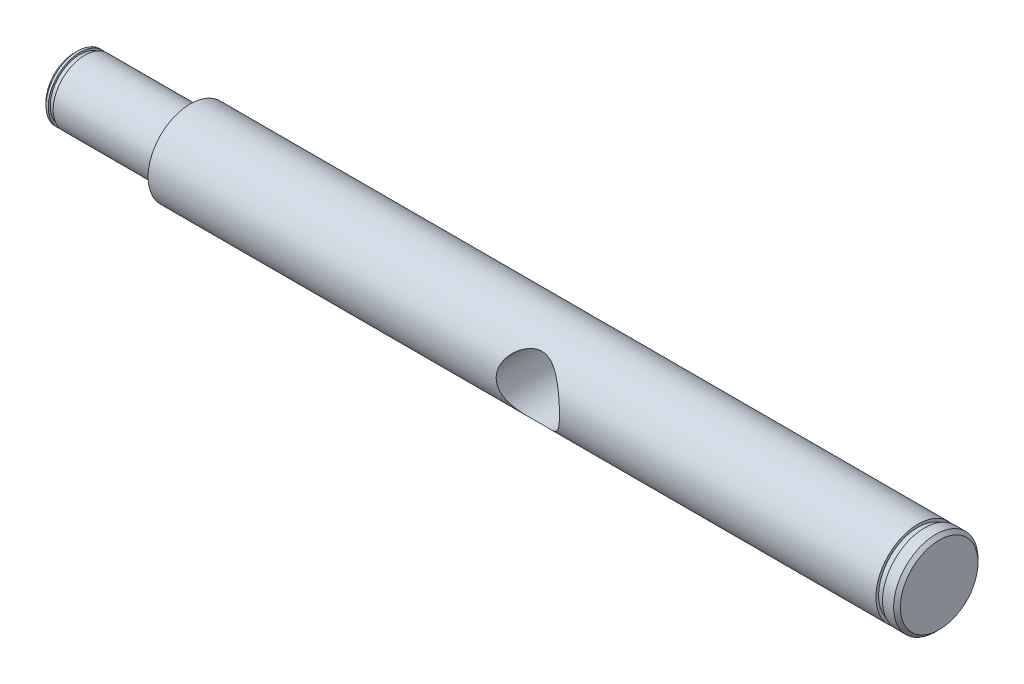
ISO-10303-21;
HEADER;
FILE_DESCRIPTION(('STEP AP214'),'2;1');
FILE_NAME('part.step','',(''),(''),'','','');
FILE_SCHEMA(('AUTOMOTIVE_DESIGN { 1 0 10303 214 1 1 1 1 }'));
ENDSEC;
DATA;
#1=APPLICATION_CONTEXT('core data for automotive mechanical design processes');
#2=APPLICATION_PROTOCOL_DEFINITION('international standard','automotive_design',2000,#1);
#3=PRODUCT_CONTEXT('',#1,'mechanical');
#4=PRODUCT('Part','Part','',(#3));
#5=PRODUCT_RELATED_PRODUCT_CATEGORY('part','',(#4));
#6=PRODUCT_DEFINITION_FORMATION('','',#4);
#7=PRODUCT_DEFINITION_CONTEXT('part definition',#1,'design');
#8=PRODUCT_DEFINITION('design','',#6,#7);
#9=PRODUCT_DEFINITION_SHAPE('','',#8);
#10=(LENGTH_UNIT() NAMED_UNIT(*) SI_UNIT(.MILLI.,.METRE.));
#11=(NAMED_UNIT(*) PLANE_ANGLE_UNIT() SI_UNIT($,.RADIAN.));
#12=(NAMED_UNIT(*) SI_UNIT($,.STERADIAN.) SOLID_ANGLE_UNIT());
#13=UNCERTAINTY_MEASURE_WITH_UNIT(LENGTH_MEASURE(1.E-05),#10,'distance_accuracy_value','');
#14=(GEOMETRIC_REPRESENTATION_CONTEXT(3) GLOBAL_UNCERTAINTY_ASSIGNED_CONTEXT((#13)) GLOBAL_UNIT_ASSIGNED_CONTEXT((#10,
#11,#12)) REPRESENTATION_CONTEXT('',''));
#15=CARTESIAN_POINT('',(0.,0.,0.));
#16=DIRECTION('',(0.,0.,1.));
#17=DIRECTION('',(1.,0.,0.));
#18=AXIS2_PLACEMENT_3D('',#15,#16,#17);
#19=CARTESIAN_POINT('',(-57.15,6.35,0.));
#20=DIRECTION('',(-1.,0.,0.));
#21=DIRECTION('',(0.,0.,1.));
#22=AXIS2_PLACEMENT_3D('',#19,#20,#21);
#23=PLANE('',#22);
#24=CARTESIAN_POINT('',(-57.15,0.,0.));
#25=DIRECTION('',(1.,0.,0.));
#26=DIRECTION('',(0.,0.,-1.));
#27=AXIS2_PLACEMENT_3D('',#24,#25,#26);
#28=CIRCLE('',#27,4.76249999999999);
#29=CARTESIAN_POINT('',(-57.15,0.,-4.76249999999999));
#30=VERTEX_POINT('',#29);
#31=EDGE_CURVE('E181',#30,#30,#28,.T.);
#32=ORIENTED_EDGE('',*,*,#31,.T.);
#33=EDGE_LOOP('',(#32));
#34=FACE_BOUND('',#33,.T.);
#35=CARTESIAN_POINT('',(-57.15,0.,0.));
#36=DIRECTION('',(1.,0.,0.));
#37=DIRECTION('',(0.,0.,-1.));
#38=AXIS2_PLACEMENT_3D('',#35,#36,#37);
#39=CIRCLE('',#38,6.35);
#40=CARTESIAN_POINT('',(-57.15,0.,-6.35));
#41=VERTEX_POINT('',#40);
#42=EDGE_CURVE('E160',#41,#41,#39,.T.);
#43=ORIENTED_EDGE('',*,*,#42,.F.);
#44=EDGE_LOOP('',(#43));
#45=FACE_BOUND('',#44,.T.);
#46=ADVANCED_FACE('F34',(#34,#45),#23,.T.);
#47=CARTESIAN_POINT('',(0.,0.,0.));
#48=DIRECTION('',(1.,0.,0.));
#49=DIRECTION('',(0.,0.,-1.));
#50=AXIS2_PLACEMENT_3D('',#47,#48,#49);
#51=CYLINDRICAL_SURFACE('',#50,6.35);
#52=CARTESIAN_POINT('',(4.7625,0.,-6.35));
#53=CARTESIAN_POINT('',(4.7624988499537,-0.116299209010284,-6.34999889011325));
#54=CARTESIAN_POINT('',(4.75823219253276,-0.232627541564826,-6.34679719779935));
#55=CARTESIAN_POINT('',(4.74123228514275,-0.464365751437165,-6.33406240886009));
#56=CARTESIAN_POINT('',(4.72849396905466,-0.579775037341468,-6.32452552374318));
#57=CARTESIAN_POINT('',(4.69472978212619,-0.808921904593725,-6.29932178537642));
#58=CARTESIAN_POINT('',(4.67368811889182,-0.922655869490629,-6.28364325155278));
#59=CARTESIAN_POINT('',(4.62364135446197,-1.14743825156485,-6.24650879607319));
#60=CARTESIAN_POINT('',(4.59463269870802,-1.2584854458909,-6.22505029570613));
#61=CARTESIAN_POINT('',(4.52928756430897,-1.47641942011833,-6.17697760117064));
#62=CARTESIAN_POINT('',(4.49300057233989,-1.58332877237456,-6.15039827015814));
#63=CARTESIAN_POINT('',(4.41343520594788,-1.79321187438471,-6.09251695768087));
#64=CARTESIAN_POINT('',(4.37015406534971,-1.89618404698207,-6.06121310800096));
#65=CARTESIAN_POINT('',(4.23059360444698,-2.19832174201322,-5.96110595313218));
#66=CARTESIAN_POINT('',(4.12451051997843,-2.39099228239341,-5.88604215862559));
#67=CARTESIAN_POINT('',(3.87900589903889,-2.77328649714528,-5.71656897819981));
#68=CARTESIAN_POINT('',(3.737406803231,-2.96097577060041,-5.62101182240466));
#69=CARTESIAN_POINT('',(3.43059012603278,-3.31161900176228,-5.42183902033635));
#70=CARTESIAN_POINT('',(3.26533608036317,-3.4745339549048,-5.3182110474076));
#71=CARTESIAN_POINT('',(2.98364957737044,-3.71464355065618,-5.15131398293456));
#72=CARTESIAN_POINT('',(2.87396162693321,-3.80014924208561,-5.0883964275921));
#73=CARTESIAN_POINT('',(2.64701532460456,-3.96157985034353,-4.96374570688252));
#74=CARTESIAN_POINT('',(2.52975470592382,-4.03750187813244,-4.90201290339735));
#75=CARTESIAN_POINT('',(2.28792332780566,-4.17928602221378,-4.78170521556719));
#76=CARTESIAN_POINT('',(2.16336004988088,-4.24515819354578,-4.72312721327798));
#77=CARTESIAN_POINT('',(1.90700474712583,-4.36633153823971,-4.61133820298109));
#78=CARTESIAN_POINT('',(1.77521689304587,-4.42163872975714,-4.55812414770428));
#79=CARTESIAN_POINT('',(1.46211699726653,-4.53644557596069,-4.44427582517158));
#80=CARTESIAN_POINT('',(1.27817307356653,-4.59187788848287,-4.38649934966294));
#81=CARTESIAN_POINT('',(0.994746725299512,-4.65846634402581,-4.31535018114968));
#82=CARTESIAN_POINT('',(0.899075743995866,-4.67789617887078,-4.29422728245458));
#83=CARTESIAN_POINT('',(0.705642690547268,-4.7109537911948,-4.25793596710256));
#84=CARTESIAN_POINT('',(0.60788172338209,-4.7245845586927,-4.24276448219178));
#85=CARTESIAN_POINT('',(0.409965732855021,-4.74587543169949,-4.21893674468418));
#86=CARTESIAN_POINT('',(0.309796807312157,-4.75347779831771,-4.21034352386483));
#87=CARTESIAN_POINT('',(0.108817678526314,-4.76231890570772,-4.20034093705962));
#88=CARTESIAN_POINT('',(0.00800749295501317,-4.7635578210877,-4.19893137395974));
#89=CARTESIAN_POINT('',(-0.193361974088127,-4.75963852863729,-4.20337374340075));
#90=CARTESIAN_POINT('',(-0.293921162651236,-4.75447822712796,-4.20922805251657));
#91=CARTESIAN_POINT('',(-0.493843814446525,-4.73788983048768,-4.22788926739262));
#92=CARTESIAN_POINT('',(-0.593207265485714,-4.72646167149834,-4.24069624398824));
#93=CARTESIAN_POINT('',(-0.867251051248547,-4.68622780810516,-4.2852403212749));
#94=CARTESIAN_POINT('',(-1.03987953504578,-4.65082267037082,-4.32394638194481));
#95=CARTESIAN_POINT('',(-1.37621692961824,-4.56265132671321,-4.41687147354087));
#96=CARTESIAN_POINT('',(-1.53991709026463,-4.50986843399956,-4.47110540837975));
#97=CARTESIAN_POINT('',(-1.82763762183055,-4.40002537741184,-4.57897962724989));
#98=CARTESIAN_POINT('',(-1.95336123401574,-4.34560239352006,-4.63084133086611));
#99=CARTESIAN_POINT('',(-2.19810392441922,-4.22708458590129,-4.73927275353937));
#100=CARTESIAN_POINT('',(-2.31711952096443,-4.16298480195269,-4.79584488039963));
#101=CARTESIAN_POINT('',(-2.54854953533765,-4.02547596393712,-4.9118381765678));
#102=CARTESIAN_POINT('',(-2.6609497369636,-3.9520478610695,-4.97126501638891));
#103=CARTESIAN_POINT('',(-2.87877433335122,-3.79631210902252,-5.09118586679689));
#104=CARTESIAN_POINT('',(-2.98419981765662,-3.71400585203825,-5.15167970882485));
#105=CARTESIAN_POINT('',(-3.19045042984524,-3.53853374029508,-5.27380236872827));
#106=CARTESIAN_POINT('',(-3.29109364576365,-3.44514714713774,-5.33542155817545));
#107=CARTESIAN_POINT('',(-3.4845176818997,-3.24938167401188,-5.45685734233337));
#108=CARTESIAN_POINT('',(-3.57729543885869,-3.14699932190559,-5.51667322894403));
#109=CARTESIAN_POINT('',(-3.75421223551902,-2.93367665220334,-5.63300747283204));
#110=CARTESIAN_POINT('',(-3.83836820447567,-2.82275388494243,-5.68953219438701));
#111=CARTESIAN_POINT('',(-3.99754145110342,-2.59242338535486,-5.79810703785869));
#112=CARTESIAN_POINT('',(-4.07255800513664,-2.47301498233865,-5.85015680536292));
#113=CARTESIAN_POINT('',(-4.19849975057002,-2.25097043945698,-5.93859502008058));
#114=CARTESIAN_POINT('',(-4.25123862964669,-2.14977661640437,-5.97603032553161));
#115=CARTESIAN_POINT('',(-4.34980135680035,-1.942623187343,-6.04654277047235));
#116=CARTESIAN_POINT('',(-4.39562662689429,-1.83666456721144,-6.07962080600354));
#117=CARTESIAN_POINT('',(-4.47984438106359,-1.62044974801033,-6.14078674098129));
#118=CARTESIAN_POINT('',(-4.51823808822972,-1.51019425971622,-6.16887546150935));
#119=CARTESIAN_POINT('',(-4.5870788512115,-1.28602254815242,-6.21947275638954));
#120=CARTESIAN_POINT('',(-4.61752914448483,-1.17210783758151,-6.24198360389949));
#121=CARTESIAN_POINT('',(-4.67021852236303,-0.940560824069623,-6.28106042317834));
#122=CARTESIAN_POINT('',(-4.69240132576367,-0.822908752534488,-6.2975856268248));
#123=CARTESIAN_POINT('',(-4.72788281599652,-0.585591049725234,-6.3240675260611));
#124=CARTESIAN_POINT('',(-4.74118554331341,-0.465926359648572,-6.33402720897412));
#125=CARTESIAN_POINT('',(-4.75868056414584,-0.225571250658379,-6.34713326881087));
#126=CARTESIAN_POINT('',(-4.76287381169491,-0.104880940486999,-6.35028035921559));
#127=CARTESIAN_POINT('',(-4.7620738908349,0.136444592782775,-6.34968041772896));
#128=CARTESIAN_POINT('',(-4.75708144630319,0.257079819472666,-6.34593392908529));
#129=CARTESIAN_POINT('',(-4.73896754997302,0.485096930719392,-6.33236726154466));
#130=CARTESIAN_POINT('',(-4.72671708437919,0.592587983283277,-6.32319801710801));
#131=CARTESIAN_POINT('',(-4.69505398371797,0.805930859053933,-6.29956495548165));
#132=CARTESIAN_POINT('',(-4.6756390835851,0.911782152804419,-6.28509946387291));
#133=CARTESIAN_POINT('',(-4.60702156194334,1.22578401856052,-6.23416160792941));
#134=CARTESIAN_POINT('',(-4.54743142848839,1.43056066614264,-6.19013661177846));
#135=CARTESIAN_POINT('',(-4.40090355043989,1.8333310949063,-6.08329287721849));
#136=CARTESIAN_POINT('',(-4.31307485918049,2.03083042618805,-6.01986569359938));
#137=CARTESIAN_POINT('',(-4.1142525938304,2.40828851889628,-5.87905118986129));
#138=CARTESIAN_POINT('',(-4.00325581510258,2.58824484869701,-5.80166193869379));
#139=CARTESIAN_POINT('',(-3.74084167222265,2.95754753649702,-5.62353773977547));
#140=CARTESIAN_POINT('',(-3.58576965817393,3.14344320753954,-5.52106237048733));
#141=CARTESIAN_POINT('',(-3.25115690534016,3.48845400785281,-5.30981660517276));
#142=CARTESIAN_POINT('',(-3.07156198417274,3.64750804110752,-5.20103258551841));
#143=CARTESIAN_POINT('',(-2.76729114314484,3.87863587098888,-5.02894509831066));
#144=CARTESIAN_POINT('',(-2.64978895171417,3.95986728301147,-4.9650454739989));
#145=CARTESIAN_POINT('',(-2.40689926755374,4.11203021770326,-4.83977327695859));
#146=CARTESIAN_POINT('',(-2.28150890177001,4.18295795604716,-4.77840163860605));
#147=CARTESIAN_POINT('',(-2.02326659807213,4.31377865736306,-4.66063787526752));
#148=CARTESIAN_POINT('',(-1.8904331873219,4.37369755879627,-4.60423421273312));
#149=CARTESIAN_POINT('',(-1.61735022525452,4.48187020978631,-4.4990025472838));
#150=CARTESIAN_POINT('',(-1.47710694084031,4.53013363042522,-4.45016827583668));
#151=CARTESIAN_POINT('',(-1.15759177093815,4.62328336303287,-4.35353293763856));
#152=CARTESIAN_POINT('',(-0.976549013938609,4.66506090965099,-4.30835007522034));
#153=CARTESIAN_POINT('',(-0.699524783874992,4.71177908281422,-4.25701269661936));
#154=CARTESIAN_POINT('',(-0.606325443686257,4.7246910921072,-4.24264307261839));
#155=CARTESIAN_POINT('',(-0.418616170115033,4.7450037130625,-4.21991447835792));
#156=CARTESIAN_POINT('',(-0.324106839478829,4.75240677898833,-4.21155283156993));
#157=CARTESIAN_POINT('',(-0.133954831077388,4.7615726616048,-4.2011872218904));
#158=CARTESIAN_POINT('',(-0.0383087911753545,4.76330490741451,-4.19921771895856));
#159=CARTESIAN_POINT('',(0.152821997299531,4.76100670685234,-4.20182318589162));
#160=CARTESIAN_POINT('',(0.248306749219778,4.75697638158626,-4.20639801822121));
#161=CARTESIAN_POINT('',(0.43843031492515,4.74323504842032,-4.22188666980964));
#162=CARTESIAN_POINT('',(0.533068267528811,4.73351880604387,-4.23280633007506));
#163=CARTESIAN_POINT('',(0.720781445555844,4.70859355844516,-4.26051540543314));
#164=CARTESIAN_POINT('',(0.813855836035324,4.69338171038877,-4.2773078583319));
#165=CARTESIAN_POINT('',(1.01791679744999,4.65384511328951,-4.32033039353146));
#166=CARTESIAN_POINT('',(1.12839345766546,4.62825761355665,-4.34781903730705));
#167=CARTESIAN_POINT('',(1.34564083047198,4.56982802217414,-4.40919076265586));
#168=CARTESIAN_POINT('',(1.4524086753396,4.53698045530095,-4.4430786674465));
#169=CARTESIAN_POINT('',(1.6620457264173,4.46445269907727,-4.51595036300489));
#170=CARTESIAN_POINT('',(1.76490670711121,4.4247589740635,-4.55494421133171));
#171=CARTESIAN_POINT('',(1.96631727667227,4.33900691641741,-4.63670457547369));
#172=CARTESIAN_POINT('',(2.06486816720444,4.29295052305786,-4.67946994034046));
#173=CARTESIAN_POINT('',(2.29113435121239,4.17772127471483,-4.7829947985753));
#174=CARTESIAN_POINT('',(2.41709508942139,4.10607445952123,-4.84484647998001));
#175=CARTESIAN_POINT('',(2.66111633875849,3.95229967522762,-4.97108986440381));
#176=CARTESIAN_POINT('',(2.77917437076166,3.87016844037568,-5.03548235451344));
#177=CARTESIAN_POINT('',(3.0072963841235,3.69570105421322,-5.1648911092052));
#178=CARTESIAN_POINT('',(3.1173542755676,3.60335726090816,-5.22990780720107));
#179=CARTESIAN_POINT('',(3.32903762204714,3.40875058933215,-5.3587816063911));
#180=CARTESIAN_POINT('',(3.43066409911911,3.30648891655268,-5.42263884739675));
#181=CARTESIAN_POINT('',(3.62579067333679,3.09132887327238,-5.54813727011885));
#182=CARTESIAN_POINT('',(3.71921527183421,2.97834830997885,-5.60975530899754));
#183=CARTESIAN_POINT('',(3.8962202948004,2.74273254325347,-5.72864113278265));
#184=CARTESIAN_POINT('',(3.97979943215544,2.62009608097834,-5.78590834855194));
#185=CARTESIAN_POINT('',(4.13597925993024,2.36586032770883,-5.89442721018252));
#186=CARTESIAN_POINT('',(4.20860075611469,2.23427872863959,-5.94569021399883));
#187=CARTESIAN_POINT('',(4.34190651288064,1.9626785584537,-6.04078339411335));
#188=CARTESIAN_POINT('',(4.40259693413779,1.822664390591,-6.0846174047917));
#189=CARTESIAN_POINT('',(4.49499127840698,1.57741877693896,-6.15185794083544));
#190=CARTESIAN_POINT('',(4.5299775994638,1.4740191867744,-6.17748626647477));
#191=CARTESIAN_POINT('',(4.59299122045473,1.26405767754273,-6.22384169023713));
#192=CARTESIAN_POINT('',(4.62102021021551,1.15749653342076,-6.24456997844401));
#193=CARTESIAN_POINT('',(4.6696960811657,0.942078631085022,-6.28067589654481));
#194=CARTESIAN_POINT('',(4.69036002851188,0.833227807097512,-6.29606589399019));
#195=CARTESIAN_POINT('',(4.72409009381477,0.613753154822266,-6.32123358358193));
#196=CARTESIAN_POINT('',(4.73716009718226,0.503130263031139,-6.33101414574013));
#197=CARTESIAN_POINT('',(4.75171566902102,0.3269208009106,-6.34191487444989));
#198=CARTESIAN_POINT('',(4.75575703143654,0.261648549896753,-6.34494408389906));
#199=CARTESIAN_POINT('',(4.76114973712483,0.13092062714484,-6.34898712126889));
#200=CARTESIAN_POINT('',(4.76250064736208,0.0654649275777545,-6.35000062475623));
#201=CARTESIAN_POINT('',(4.7625,0.,-6.35));
#202=B_SPLINE_CURVE_WITH_KNOTS('',3,(#52,#53,#54,#55,#56,#57,#58,#59,#60,#61,#62,#63,#64,#65,
#66,#67,#68,#69,#70,#71,#72,#73,#74,#75,#76,#77,#78,#79,#80,#81,#82,#83,#84,#85,#86,#87,#88,#89,
#90,#91,#92,#93,#94,#95,#96,#97,#98,#99,#100,#101,#102,#103,#104,#105,#106,#107,#108,#109,#110,
#111,#112,#113,#114,#115,#116,#117,#118,#119,#120,#121,#122,#123,#124,#125,#126,#127,#128,#129,
#130,#131,#132,#133,#134,#135,#136,#137,#138,#139,#140,#141,#142,#143,#144,#145,#146,#147,#148,
#149,#150,#151,#152,#153,#154,#155,#156,#157,#158,#159,#160,#161,#162,#163,#164,#165,#166,#167,
#168,#169,#170,#171,#172,#173,#174,#175,#176,#177,#178,#179,#180,#181,#182,#183,#184,#185,#186,
#187,#188,#189,#190,#191,#192,#193,#194,#195,#196,#197,#198,#199,#200,#201),.UNSPECIFIED.,.T.,
.F.,(4,2,2,2,2,2,2,2,2,2,2,2,2,2,2,2,2,2,2,2,2,2,2,2,2,2,2,2,2,2,2,2,2,2,2,2,2,2,2,2,2,2,2,2,2,
2,2,2,2,2,2,2,2,2,2,2,2,2,2,2,2,2,2,2,2,2,2,2,2,2,2,2,2,2,4),(0.,0.348826969653844,
0.697862728397022,1.04756555362441,1.3974246566635,1.74498106823517,2.09267527578353,
2.78716228303455,3.54596161101643,4.30594348855195,4.76346546727637,5.22112504039627,
5.67832367191603,6.13526108651819,6.73463582354853,7.03398487231736,7.33317938809093,
7.63520604155019,7.93722440758682,8.23934161327282,8.54146189705609,9.08054184069044,
9.62014094684475,10.0590246637803,10.4981341163889,10.9381551122271,11.3781072078254,
11.8291031642958,12.2802739650851,12.7305411728239,13.180844008548,13.5407901299426,
13.9006621150423,14.2604748217557,14.620140651465,14.9822120355385,15.3441185625935,
15.7059871854408,16.0678272924957,16.3931600201895,16.7185956914089,17.3689364396777,
18.042229457385,18.7156156675651,19.5014576348775,20.2890648640663,20.7580579668148,
21.2272228878385,21.6952677989297,22.1629230071761,22.7340282141133,23.0192712165018,
23.3043870654148,23.591037438876,23.8776817882011,24.164590439447,24.4516477193213,
24.8011756648458,25.1509681139139,25.5014602422859,25.8518457791523,26.3238881989897,
26.7960780139453,27.2686235874385,27.7411117961052,28.2175720907235,28.6940946048345,
29.1697006194452,29.6450604035083,29.9811084296957,30.317074755045,30.6522574444161,
30.9872684875557,31.1835919009605,31.3799469105938),.UNSPECIFIED.);
#203=CARTESIAN_POINT('',(4.7625,0.,-6.35));
#204=VERTEX_POINT('',#203);
#205=EDGE_CURVE('E54',#204,#204,#202,.T.);
#206=ORIENTED_EDGE('',*,*,#205,.F.);
#207=EDGE_LOOP('',(#206));
#208=FACE_BOUND('',#207,.T.);
#209=CARTESIAN_POINT('',(4.7625,0.,6.35));
#210=CARTESIAN_POINT('',(4.7624988499537,0.116299209010284,6.34999889011325));
#211=CARTESIAN_POINT('',(4.75823219253276,0.232627541564826,6.34679719779935));
#212=CARTESIAN_POINT('',(4.74123228514275,0.464365751437165,6.33406240886009));
#213=CARTESIAN_POINT('',(4.72849396905466,0.579775037341468,6.32452552374318));
#214=CARTESIAN_POINT('',(4.69472978212619,0.808921904593725,6.29932178537642));
#215=CARTESIAN_POINT('',(4.67368811889182,0.922655869490629,6.28364325155278));
#216=CARTESIAN_POINT('',(4.62364135446197,1.14743825156485,6.24650879607319));
#217=CARTESIAN_POINT('',(4.59463269870802,1.2584854458909,6.22505029570613));
#218=CARTESIAN_POINT('',(4.52928756430897,1.47641942011833,6.17697760117064));
#219=CARTESIAN_POINT('',(4.49300057233989,1.58332877237456,6.15039827015814));
#220=CARTESIAN_POINT('',(4.41343520594788,1.79321187438471,6.09251695768087));
#221=CARTESIAN_POINT('',(4.37015406534971,1.89618404698207,6.06121310800096));
#222=CARTESIAN_POINT('',(4.23059360444698,2.19832174201322,5.96110595313218));
#223=CARTESIAN_POINT('',(4.12451051997843,2.39099228239341,5.88604215862559));
#224=CARTESIAN_POINT('',(3.87900589903889,2.77328649714528,5.71656897819981));
#225=CARTESIAN_POINT('',(3.737406803231,2.96097577060041,5.62101182240466));
#226=CARTESIAN_POINT('',(3.43059012603278,3.31161900176228,5.42183902033635));
#227=CARTESIAN_POINT('',(3.26533608036317,3.4745339549048,5.3182110474076));
#228=CARTESIAN_POINT('',(2.98364957737044,3.71464355065618,5.15131398293456));
#229=CARTESIAN_POINT('',(2.87396162693321,3.80014924208561,5.0883964275921));
#230=CARTESIAN_POINT('',(2.64701532460456,3.96157985034353,4.96374570688252));
#231=CARTESIAN_POINT('',(2.52975470592382,4.03750187813244,4.90201290339735));
#232=CARTESIAN_POINT('',(2.28792332780566,4.17928602221378,4.78170521556719));
#233=CARTESIAN_POINT('',(2.16336004988088,4.24515819354578,4.72312721327798));
#234=CARTESIAN_POINT('',(1.90700474712583,4.36633153823971,4.61133820298109));
#235=CARTESIAN_POINT('',(1.77521689304587,4.42163872975714,4.55812414770428));
#236=CARTESIAN_POINT('',(1.46211699726653,4.53644557596069,4.44427582517158));
#237=CARTESIAN_POINT('',(1.27817307356653,4.59187788848287,4.38649934966294));
#238=CARTESIAN_POINT('',(0.994746725299509,4.65846634402581,4.31535018114968));
#239=CARTESIAN_POINT('',(0.899075743995863,4.67789617887078,4.29422728245458));
#240=CARTESIAN_POINT('',(0.705642690547266,4.7109537911948,4.25793596710256));
#241=CARTESIAN_POINT('',(0.607881723382088,4.72458455869271,4.24276448219178));
#242=CARTESIAN_POINT('',(0.409965732855018,4.74587543169949,4.21893674468418));
#243=CARTESIAN_POINT('',(0.309796807312155,4.75347779831771,4.21034352386483));
#244=CARTESIAN_POINT('',(0.108817678526312,4.76231890570772,4.20034093705962));
#245=CARTESIAN_POINT('',(0.00800749295501031,4.7635578210877,4.19893137395975));
#246=CARTESIAN_POINT('',(-0.19336197408813,4.75963852863729,4.20337374340076));
#247=CARTESIAN_POINT('',(-0.293921162651239,4.75447822712796,4.20922805251657));
#248=CARTESIAN_POINT('',(-0.493843814446528,4.73788983048768,4.22788926739262));
#249=CARTESIAN_POINT('',(-0.593207265485717,4.72646167149834,4.24069624398823));
#250=CARTESIAN_POINT('',(-0.867251051248549,4.68622780810516,4.2852403212749));
#251=CARTESIAN_POINT('',(-1.03987953504578,4.65082267037082,4.32394638194481));
#252=CARTESIAN_POINT('',(-1.37621692961825,4.56265132671321,4.41687147354087));
#253=CARTESIAN_POINT('',(-1.53991709026463,4.50986843399956,4.47110540837975));
#254=CARTESIAN_POINT('',(-1.82763762183056,4.40002537741184,4.57897962724989));
#255=CARTESIAN_POINT('',(-1.95336123401574,4.34560239352006,4.63084133086611));
#256=CARTESIAN_POINT('',(-2.19810392441922,4.22708458590128,4.73927275353937));
#257=CARTESIAN_POINT('',(-2.31711952096443,4.16298480195269,4.79584488039963));
#258=CARTESIAN_POINT('',(-2.54854953533766,4.02547596393712,4.9118381765678));
#259=CARTESIAN_POINT('',(-2.6609497369636,3.95204786106949,4.97126501638891));
#260=CARTESIAN_POINT('',(-2.87877433335122,3.79631210902252,5.09118586679689));
#261=CARTESIAN_POINT('',(-2.98419981765662,3.71400585203825,5.15167970882485));
#262=CARTESIAN_POINT('',(-3.19045042984524,3.53853374029508,5.27380236872828));
#263=CARTESIAN_POINT('',(-3.29109364576365,3.44514714713773,5.33542155817545));
#264=CARTESIAN_POINT('',(-3.48451768189971,3.24938167401188,5.45685734233337));
#265=CARTESIAN_POINT('',(-3.57729543885869,3.14699932190559,5.51667322894403));
#266=CARTESIAN_POINT('',(-3.75421223551902,2.93367665220334,5.63300747283204));
#267=CARTESIAN_POINT('',(-3.83836820447567,2.82275388494243,5.68953219438701));
#268=CARTESIAN_POINT('',(-3.99754145110342,2.59242338535486,5.79810703785869));
#269=CARTESIAN_POINT('',(-4.07255800513664,2.47301498233865,5.85015680536292));
#270=CARTESIAN_POINT('',(-4.19849975057002,2.25097043945698,5.93859502008058));
#271=CARTESIAN_POINT('',(-4.25123862964669,2.14977661640437,5.97603032553161));
#272=CARTESIAN_POINT('',(-4.34980135680035,1.942623187343,6.04654277047235));
#273=CARTESIAN_POINT('',(-4.39562662689429,1.83666456721144,6.07962080600354));
#274=CARTESIAN_POINT('',(-4.47984438106359,1.62044974801033,6.14078674098129));
#275=CARTESIAN_POINT('',(-4.51823808822972,1.51019425971622,6.16887546150935));
#276=CARTESIAN_POINT('',(-4.5870788512115,1.28602254815242,6.21947275638954));
#277=CARTESIAN_POINT('',(-4.61752914448483,1.17210783758151,6.24198360389949));
#278=CARTESIAN_POINT('',(-4.67021852236303,0.940560824069623,6.28106042317834));
#279=CARTESIAN_POINT('',(-4.69240132576367,0.822908752534488,6.2975856268248));
#280=CARTESIAN_POINT('',(-4.72788281599652,0.585591049725234,6.3240675260611));
#281=CARTESIAN_POINT('',(-4.74118554331341,0.465926359648573,6.33402720897412));
#282=CARTESIAN_POINT('',(-4.75868056414584,0.22557125065838,6.34713326881087));
#283=CARTESIAN_POINT('',(-4.76287381169491,0.104880940487,6.35028035921559));
#284=CARTESIAN_POINT('',(-4.7620738908349,-0.136444592782774,6.34968041772896));
#285=CARTESIAN_POINT('',(-4.75708144630319,-0.257079819472666,6.34593392908529));
#286=CARTESIAN_POINT('',(-4.73896754997302,-0.485096930719391,6.33236726154466));
#287=CARTESIAN_POINT('',(-4.72671708437919,-0.592587983283276,6.32319801710801));
#288=CARTESIAN_POINT('',(-4.69505398371797,-0.805930859053932,6.29956495548165));
#289=CARTESIAN_POINT('',(-4.6756390835851,-0.911782152804419,6.28509946387291));
#290=CARTESIAN_POINT('',(-4.60702156194334,-1.22578401856051,6.23416160792941));
#291=CARTESIAN_POINT('',(-4.54743142848839,-1.43056066614264,6.19013661177846));
#292=CARTESIAN_POINT('',(-4.40090355043989,-1.8333310949063,6.08329287721849));
#293=CARTESIAN_POINT('',(-4.31307485918049,-2.03083042618805,6.01986569359938));
#294=CARTESIAN_POINT('',(-4.11425259383041,-2.40828851889628,5.87905118986129));
#295=CARTESIAN_POINT('',(-4.00325581510258,-2.58824484869701,5.80166193869379));
#296=CARTESIAN_POINT('',(-3.74084167222265,-2.95754753649702,5.62353773977547));
#297=CARTESIAN_POINT('',(-3.58576965817393,-3.14344320753954,5.52106237048733));
#298=CARTESIAN_POINT('',(-3.25115690534016,-3.48845400785281,5.30981660517276));
#299=CARTESIAN_POINT('',(-3.07156198417274,-3.64750804110752,5.20103258551841));
#300=CARTESIAN_POINT('',(-2.76729114314484,-3.87863587098888,5.02894509831066));
#301=CARTESIAN_POINT('',(-2.64978895171417,-3.95986728301147,4.9650454739989));
#302=CARTESIAN_POINT('',(-2.40689926755374,-4.11203021770326,4.83977327695859));
#303=CARTESIAN_POINT('',(-2.28150890177001,-4.18295795604716,4.77840163860605));
#304=CARTESIAN_POINT('',(-2.02326659807213,-4.31377865736306,4.66063787526752));
#305=CARTESIAN_POINT('',(-1.8904331873219,-4.37369755879627,4.60423421273312));
#306=CARTESIAN_POINT('',(-1.61735022525452,-4.48187020978631,4.4990025472838));
#307=CARTESIAN_POINT('',(-1.47710694084031,-4.53013363042522,4.45016827583668));
#308=CARTESIAN_POINT('',(-1.15759177093815,-4.62328336303287,4.35353293763856));
#309=CARTESIAN_POINT('',(-0.976549013938611,-4.66506090965099,4.30835007522034));
#310=CARTESIAN_POINT('',(-0.699524783874994,-4.71177908281422,4.25701269661936));
#311=CARTESIAN_POINT('',(-0.60632544368626,-4.7246910921072,4.24264307261839));
#312=CARTESIAN_POINT('',(-0.418616170115037,-4.7450037130625,4.21991447835792));
#313=CARTESIAN_POINT('',(-0.324106839478831,-4.75240677898833,4.21155283156993));
#314=CARTESIAN_POINT('',(-0.133954831077389,-4.7615726616048,4.2011872218904));
#315=CARTESIAN_POINT('',(-0.0383087911753561,-4.76330490741451,4.19921771895856));
#316=CARTESIAN_POINT('',(0.152821997299529,-4.76100670685234,4.20182318589162));
#317=CARTESIAN_POINT('',(0.248306749219776,-4.75697638158626,4.20639801822121));
#318=CARTESIAN_POINT('',(0.438430314925149,-4.74323504842032,4.22188666980964));
#319=CARTESIAN_POINT('',(0.533068267528809,-4.73351880604387,4.23280633007506));
#320=CARTESIAN_POINT('',(0.720781445555842,-4.70859355844516,4.26051540543314));
#321=CARTESIAN_POINT('',(0.813855836035323,-4.69338171038877,4.2773078583319));
#322=CARTESIAN_POINT('',(1.01791679744999,-4.65384511328951,4.32033039353146));
#323=CARTESIAN_POINT('',(1.12839345766545,-4.62825761355665,4.34781903730705));
#324=CARTESIAN_POINT('',(1.34564083047197,-4.56982802217414,4.40919076265586));
#325=CARTESIAN_POINT('',(1.45240867533959,-4.53698045530095,4.4430786674465));
#326=CARTESIAN_POINT('',(1.6620457264173,-4.46445269907728,4.51595036300489));
#327=CARTESIAN_POINT('',(1.76490670711121,-4.4247589740635,4.55494421133171));
#328=CARTESIAN_POINT('',(1.96631727667227,-4.33900691641741,4.63670457547369));
#329=CARTESIAN_POINT('',(2.06486816720444,-4.29295052305786,4.67946994034046));
#330=CARTESIAN_POINT('',(2.29113435121239,-4.17772127471483,4.7829947985753));
#331=CARTESIAN_POINT('',(2.41709508942139,-4.10607445952123,4.84484647998001));
#332=CARTESIAN_POINT('',(2.66111633875849,-3.95229967522762,4.97108986440381));
#333=CARTESIAN_POINT('',(2.77917437076166,-3.87016844037569,5.03548235451344));
#334=CARTESIAN_POINT('',(3.0072963841235,-3.69570105421322,5.1648911092052));
#335=CARTESIAN_POINT('',(3.11735427556759,-3.60335726090816,5.22990780720107));
#336=CARTESIAN_POINT('',(3.32903762204714,-3.40875058933216,5.35878160639109));
#337=CARTESIAN_POINT('',(3.43066409911911,-3.30648891655268,5.42263884739674));
#338=CARTESIAN_POINT('',(3.62579067333679,-3.09132887327239,5.54813727011885));
#339=CARTESIAN_POINT('',(3.71921527183421,-2.97834830997886,5.60975530899754));
#340=CARTESIAN_POINT('',(3.8962202948004,-2.74273254325347,5.72864113278265));
#341=CARTESIAN_POINT('',(3.97979943215543,-2.62009608097834,5.78590834855194));
#342=CARTESIAN_POINT('',(4.13597925993024,-2.36586032770883,5.89442721018252));
#343=CARTESIAN_POINT('',(4.20860075611469,-2.23427872863959,5.94569021399883));
#344=CARTESIAN_POINT('',(4.34190651288064,-1.96267855845371,6.04078339411334));
#345=CARTESIAN_POINT('',(4.40259693413779,-1.822664390591,6.0846174047917));
#346=CARTESIAN_POINT('',(4.49499127840698,-1.57741877693897,6.15185794083544));
#347=CARTESIAN_POINT('',(4.5299775994638,-1.4740191867744,6.17748626647477));
#348=CARTESIAN_POINT('',(4.59299122045473,-1.26405767754274,6.22384169023712));
#349=CARTESIAN_POINT('',(4.62102021021551,-1.15749653342076,6.24456997844401));
#350=CARTESIAN_POINT('',(4.6696960811657,-0.942078631085027,6.28067589654481));
#351=CARTESIAN_POINT('',(4.69036002851188,-0.833227807097519,6.29606589399018));
#352=CARTESIAN_POINT('',(4.72409009381477,-0.613753154822273,6.32123358358193));
#353=CARTESIAN_POINT('',(4.73716009718226,-0.503130263031145,6.33101414574012));
#354=CARTESIAN_POINT('',(4.75171566902102,-0.326920800910604,6.34191487444989));
#355=CARTESIAN_POINT('',(4.75575703143654,-0.261648549896757,6.34494408389906));
#356=CARTESIAN_POINT('',(4.76114973712483,-0.130920627144842,6.34898712126889));
#357=CARTESIAN_POINT('',(4.76250064736208,-0.0654649275777553,6.35000062475623));
#358=CARTESIAN_POINT('',(4.7625,0.,6.35));
#359=B_SPLINE_CURVE_WITH_KNOTS('',3,(#209,#210,#211,#212,#213,#214,#215,#216,#217,#218,#219,
#220,#221,#222,#223,#224,#225,#226,#227,#228,#229,#230,#231,#232,#233,#234,#235,#236,#237,#238,
#239,#240,#241,#242,#243,#244,#245,#246,#247,#248,#249,#250,#251,#252,#253,#254,#255,#256,#257,
#258,#259,#260,#261,#262,#263,#264,#265,#266,#267,#268,#269,#270,#271,#272,#273,#274,#275,#276,
#277,#278,#279,#280,#281,#282,#283,#284,#285,#286,#287,#288,#289,#290,#291,#292,#293,#294,#295,
#296,#297,#298,#299,#300,#301,#302,#303,#304,#305,#306,#307,#308,#309,#310,#311,#312,#313,#314,
#315,#316,#317,#318,#319,#320,#321,#322,#323,#324,#325,#326,#327,#328,#329,#330,#331,#332,#333,
#334,#335,#336,#337,#338,#339,#340,#341,#342,#343,#344,#345,#346,#347,#348,#349,#350,#351,#352,
#353,#354,#355,#356,#357,#358),.UNSPECIFIED.,.T.,.F.,(4,2,2,2,2,2,2,2,2,2,2,2,2,2,2,2,2,2,2,2,2,
2,2,2,2,2,2,2,2,2,2,2,2,2,2,2,2,2,2,2,2,2,2,2,2,2,2,2,2,2,2,2,2,2,2,2,2,2,2,2,2,2,2,2,2,2,2,2,2,
2,2,2,2,2,4),(0.,0.348826969653844,0.697862728397022,1.04756555362441,1.3974246566635,
1.74498106823517,2.09267527578353,2.78716228303455,3.54596161101643,4.30594348855195,
4.76346546727637,5.22112504039628,5.67832367191604,6.1352610865182,6.73463582354854,
7.03398487231737,7.33317938809093,7.6352060415502,7.93722440758683,8.23934161327283,
8.5414618970561,9.08054184069045,9.62014094684475,10.0590246637804,10.4981341163889,
10.9381551122272,11.3781072078254,11.8291031642958,12.2802739650851,12.7305411728239,
13.180844008548,13.5407901299426,13.9006621150424,14.2604748217557,14.620140651465,
14.9822120355385,15.3441185625935,15.7059871854409,16.0678272924957,16.3931600201895,
16.718595691409,17.3689364396777,18.042229457385,18.7156156675651,19.5014576348775,
20.2890648640663,20.7580579668148,21.2272228878385,21.6952677989297,22.1629230071761,
22.7340282141133,23.0192712165018,23.3043870654148,23.591037438876,23.8776817882011,
24.164590439447,24.4516477193213,24.8011756648458,25.1509681139139,25.5014602422859,
25.8518457791523,26.3238881989897,26.7960780139453,27.2686235874385,27.7411117961052,
28.2175720907235,28.6940946048345,29.1697006194452,29.6450604035083,29.9811084296957,
30.317074755045,30.6522574444161,30.9872684875556,31.1835919009605,31.3799469105938),.UNSPECIFIED.);
#360=CARTESIAN_POINT('',(4.7625,0.,6.35));
#361=VERTEX_POINT('',#360);
#362=EDGE_CURVE('E62',#361,#361,#359,.T.);
#363=ORIENTED_EDGE('',*,*,#362,.F.);
#364=EDGE_LOOP('',(#363));
#365=FACE_BOUND('',#364,.T.);
#366=ORIENTED_EDGE('',*,*,#42,.T.);
#367=EDGE_LOOP('',(#366));
#368=FACE_BOUND('',#367,.T.);
#369=CARTESIAN_POINT('',(52.3875,0.,0.));
#370=DIRECTION('',(1.,0.,0.));
#371=DIRECTION('',(0.,0.,-1.));
#372=AXIS2_PLACEMENT_3D('',#369,#370,#371);
#373=CIRCLE('',#372,6.34999999999999);
#374=CARTESIAN_POINT('',(52.3875,0.,-6.34999999999999));
#375=VERTEX_POINT('',#374);
#376=EDGE_CURVE('E159',#375,#375,#373,.T.);
#377=ORIENTED_EDGE('',*,*,#376,.F.);
#378=EDGE_LOOP('',(#377));
#379=FACE_BOUND('',#378,.T.);
#380=ADVANCED_FACE('F67',(#208,#365,#368,#379),#51,.T.);
#381=CARTESIAN_POINT('',(52.3875,5.94360000000001,0.));
#382=DIRECTION('',(1.,0.,0.));
#383=DIRECTION('',(0.,0.,-1.));
#384=AXIS2_PLACEMENT_3D('',#381,#382,#383);
#385=PLANE('',#384);
#386=ORIENTED_EDGE('',*,*,#376,.T.);
#387=EDGE_LOOP('',(#386));
#388=FACE_BOUND('',#387,.T.);
#389=CARTESIAN_POINT('',(52.3875,0.,0.));
#390=DIRECTION('',(1.,0.,0.));
#391=DIRECTION('',(0.,0.,-1.));
#392=AXIS2_PLACEMENT_3D('',#389,#390,#391);
#393=CIRCLE('',#392,5.94360000000001);
#394=CARTESIAN_POINT('',(52.3875,0.,-5.94360000000001));
#395=VERTEX_POINT('',#394);
#396=EDGE_CURVE('E156',#395,#395,#393,.T.);
#397=ORIENTED_EDGE('',*,*,#396,.F.);
#398=EDGE_LOOP('',(#397));
#399=FACE_BOUND('',#398,.T.);
#400=ADVANCED_FACE('F114',(#388,#399),#385,.T.);
#401=CARTESIAN_POINT('',(0.,0.,0.));
#402=DIRECTION('',(1.,0.,0.));
#403=DIRECTION('',(0.,0.,-1.));
#404=AXIS2_PLACEMENT_3D('',#401,#402,#403);
#405=CYLINDRICAL_SURFACE('',#404,5.94360000000001);
#406=ORIENTED_EDGE('',*,*,#396,.T.);
#407=EDGE_LOOP('',(#406));
#408=FACE_BOUND('',#407,.T.);
#409=CARTESIAN_POINT('',(53.3781,0.,0.));
#410=DIRECTION('',(1.,0.,0.));
#411=DIRECTION('',(0.,0.,-1.));
#412=AXIS2_PLACEMENT_3D('',#409,#410,#411);
#413=CIRCLE('',#412,5.94360000000001);
#414=CARTESIAN_POINT('',(53.3781,0.,-5.94360000000001));
#415=VERTEX_POINT('',#414);
#416=EDGE_CURVE('E147',#415,#415,#413,.T.);
#417=ORIENTED_EDGE('',*,*,#416,.F.);
#418=EDGE_LOOP('',(#417));
#419=FACE_BOUND('',#418,.T.);
#420=ADVANCED_FACE('F111',(#408,#419),#405,.T.);
#421=CARTESIAN_POINT('',(53.3781,6.34999999999999,0.));
#422=DIRECTION('',(-1.,0.,0.));
#423=DIRECTION('',(0.,0.,1.));
#424=AXIS2_PLACEMENT_3D('',#421,#422,#423);
#425=PLANE('',#424);
#426=ORIENTED_EDGE('',*,*,#416,.T.);
#427=EDGE_LOOP('',(#426));
#428=FACE_BOUND('',#427,.T.);
#429=CARTESIAN_POINT('',(53.3781,0.,0.));
#430=DIRECTION('',(1.,0.,0.));
#431=DIRECTION('',(0.,0.,-1.));
#432=AXIS2_PLACEMENT_3D('',#429,#430,#431);
#433=CIRCLE('',#432,6.34999999999999);
#434=CARTESIAN_POINT('',(53.3781,0.,-6.34999999999999));
#435=VERTEX_POINT('',#434);
#436=EDGE_CURVE('E143',#435,#435,#433,.T.);
#437=ORIENTED_EDGE('',*,*,#436,.F.);
#438=EDGE_LOOP('',(#437));
#439=FACE_BOUND('',#438,.T.);
#440=ADVANCED_FACE('F108',(#428,#439),#425,.T.);
#441=CARTESIAN_POINT('',(0.,0.,0.));
#442=DIRECTION('',(1.,0.,0.));
#443=DIRECTION('',(0.,0.,-1.));
#444=AXIS2_PLACEMENT_3D('',#441,#442,#443);
#445=CYLINDRICAL_SURFACE('',#444,6.34999999999999);
#446=CARTESIAN_POINT('',(55.0545,0.,0.));
#447=DIRECTION('',(1.,0.,0.));
#448=DIRECTION('',(0.,0.,-1.));
#449=AXIS2_PLACEMENT_3D('',#446,#447,#448);
#450=CIRCLE('',#449,6.34999999999999);
#451=CARTESIAN_POINT('',(55.0545,0.,-6.34999999999999));
#452=VERTEX_POINT('',#451);
#453=EDGE_CURVE('E10',#452,#452,#450,.F.);
#454=ORIENTED_EDGE('',*,*,#453,.T.);
#455=EDGE_LOOP('',(#454));
#456=FACE_BOUND('',#455,.T.);
#457=ORIENTED_EDGE('',*,*,#436,.T.);
#458=EDGE_LOOP('',(#457));
#459=FACE_BOUND('',#458,.T.);
#460=ADVANCED_FACE('F105',(#456,#459),#445,.T.);
#461=CARTESIAN_POINT('',(55.5625,0.,0.));
#462=DIRECTION('',(1.,0.,0.));
#463=DIRECTION('',(0.,0.,-1.));
#464=AXIS2_PLACEMENT_3D('',#461,#462,#463);
#465=PLANE('',#464);
#466=CARTESIAN_POINT('',(55.5625,0.,0.));
#467=DIRECTION('',(1.,0.,0.));
#468=DIRECTION('',(0.,0.,-1.));
#469=AXIS2_PLACEMENT_3D('',#466,#467,#468);
#470=CIRCLE('',#469,5.842);
#471=CARTESIAN_POINT('',(55.5625,0.,-5.842));
#472=VERTEX_POINT('',#471);
#473=EDGE_CURVE('E41',#472,#472,#470,.T.);
#474=ORIENTED_EDGE('',*,*,#473,.T.);
#475=EDGE_LOOP('',(#474));
#476=FACE_BOUND('',#475,.T.);
#477=ADVANCED_FACE('F101',(#476),#465,.T.);
#478=CARTESIAN_POINT('',(-74.6125,4.76249999999999,0.));
#479=DIRECTION('',(-1.,0.,0.));
#480=DIRECTION('',(0.,0.,1.));
#481=AXIS2_PLACEMENT_3D('',#478,#479,#480);
#482=PLANE('',#481);
#483=CARTESIAN_POINT('',(-74.6125,0.,0.));
#484=DIRECTION('',(-1.,0.,0.));
#485=DIRECTION('',(0.,0.,1.));
#486=AXIS2_PLACEMENT_3D('',#483,#484,#485);
#487=CIRCLE('',#486,4.25449999999995);
#488=CARTESIAN_POINT('',(-74.6125,0.,4.25449999999995));
#489=VERTEX_POINT('',#488);
#490=EDGE_CURVE('E45',#489,#489,#487,.T.);
#491=ORIENTED_EDGE('',*,*,#490,.T.);
#492=EDGE_LOOP('',(#491));
#493=FACE_BOUND('',#492,.T.);
#494=ADVANCED_FACE('F97',(#493),#482,.T.);
#495=CARTESIAN_POINT('',(0.,0.,0.));
#496=DIRECTION('',(1.,0.,0.));
#497=DIRECTION('',(0.,0.,-1.));
#498=AXIS2_PLACEMENT_3D('',#495,#496,#497);
#499=CYLINDRICAL_SURFACE('',#498,4.76249999999999);
#500=CARTESIAN_POINT('',(-74.1045,0.,0.));
#501=DIRECTION('',(-1.,0.,0.));
#502=DIRECTION('',(0.,0.,1.));
#503=AXIS2_PLACEMENT_3D('',#500,#501,#502);
#504=CIRCLE('',#503,4.76249999999999);
#505=CARTESIAN_POINT('',(-74.1045,0.,4.76249999999999));
#506=VERTEX_POINT('',#505);
#507=EDGE_CURVE('E49',#506,#506,#504,.F.);
#508=ORIENTED_EDGE('',*,*,#507,.T.);
#509=EDGE_LOOP('',(#508));
#510=FACE_BOUND('',#509,.T.);
#511=CARTESIAN_POINT('',(-73.7616,0.,0.));
#512=DIRECTION('',(1.,0.,0.));
#513=DIRECTION('',(0.,0.,-1.));
#514=AXIS2_PLACEMENT_3D('',#511,#512,#513);
#515=CIRCLE('',#514,4.76249999999999);
#516=CARTESIAN_POINT('',(-73.7616,0.,-4.76249999999999));
#517=VERTEX_POINT('',#516);
#518=EDGE_CURVE('E142',#517,#517,#515,.T.);
#519=ORIENTED_EDGE('',*,*,#518,.F.);
#520=EDGE_LOOP('',(#519));
#521=FACE_BOUND('',#520,.T.);
#522=ADVANCED_FACE('F93',(#510,#521),#499,.T.);
#523=CARTESIAN_POINT('',(-73.7616,4.47039999999999,0.));
#524=DIRECTION('',(1.,0.,0.));
#525=DIRECTION('',(0.,0.,-1.));
#526=AXIS2_PLACEMENT_3D('',#523,#524,#525);
#527=PLANE('',#526);
#528=ORIENTED_EDGE('',*,*,#518,.T.);
#529=EDGE_LOOP('',(#528));
#530=FACE_BOUND('',#529,.T.);
#531=CARTESIAN_POINT('',(-73.7616,0.,0.));
#532=DIRECTION('',(1.,0.,0.));
#533=DIRECTION('',(0.,0.,-1.));
#534=AXIS2_PLACEMENT_3D('',#531,#532,#533);
#535=CIRCLE('',#534,4.47039999999999);
#536=CARTESIAN_POINT('',(-73.7616,0.,-4.47039999999999));
#537=VERTEX_POINT('',#536);
#538=EDGE_CURVE('E144',#537,#537,#535,.T.);
#539=ORIENTED_EDGE('',*,*,#538,.F.);
#540=EDGE_LOOP('',(#539));
#541=FACE_BOUND('',#540,.T.);
#542=ADVANCED_FACE('F89',(#530,#541),#527,.T.);
#543=CARTESIAN_POINT('',(0.,0.,0.));
#544=DIRECTION('',(1.,0.,0.));
#545=DIRECTION('',(0.,0.,-1.));
#546=AXIS2_PLACEMENT_3D('',#543,#544,#545);
#547=CYLINDRICAL_SURFACE('',#546,4.47039999999999);
#548=ORIENTED_EDGE('',*,*,#538,.T.);
#549=EDGE_LOOP('',(#548));
#550=FACE_BOUND('',#549,.T.);
#551=CARTESIAN_POINT('',(-73.025,0.,0.));
#552=DIRECTION('',(1.,0.,0.));
#553=DIRECTION('',(0.,0.,-1.));
#554=AXIS2_PLACEMENT_3D('',#551,#552,#553);
#555=CIRCLE('',#554,4.47039999999999);
#556=CARTESIAN_POINT('',(-73.025,0.,-4.47039999999999));
#557=VERTEX_POINT('',#556);
#558=EDGE_CURVE('E150',#557,#557,#555,.T.);
#559=ORIENTED_EDGE('',*,*,#558,.F.);
#560=EDGE_LOOP('',(#559));
#561=FACE_BOUND('',#560,.T.);
#562=ADVANCED_FACE('F85',(#550,#561),#547,.T.);
#563=CARTESIAN_POINT('',(-73.025,4.76249999999999,0.));
#564=DIRECTION('',(-1.,0.,0.));
#565=DIRECTION('',(0.,0.,1.));
#566=AXIS2_PLACEMENT_3D('',#563,#564,#565);
#567=PLANE('',#566);
#568=ORIENTED_EDGE('',*,*,#558,.T.);
#569=EDGE_LOOP('',(#568));
#570=FACE_BOUND('',#569,.T.);
#571=CARTESIAN_POINT('',(-73.025,0.,0.));
#572=DIRECTION('',(1.,0.,0.));
#573=DIRECTION('',(0.,0.,-1.));
#574=AXIS2_PLACEMENT_3D('',#571,#572,#573);
#575=CIRCLE('',#574,4.76249999999999);
#576=CARTESIAN_POINT('',(-73.025,0.,-4.76249999999999));
#577=VERTEX_POINT('',#576);
#578=EDGE_CURVE('E178',#577,#577,#575,.T.);
#579=ORIENTED_EDGE('',*,*,#578,.F.);
#580=EDGE_LOOP('',(#579));
#581=FACE_BOUND('',#580,.T.);
#582=ADVANCED_FACE('F81',(#570,#581),#567,.T.);
#583=CARTESIAN_POINT('',(0.,0.,0.));
#584=DIRECTION('',(1.,0.,0.));
#585=DIRECTION('',(0.,0.,-1.));
#586=AXIS2_PLACEMENT_3D('',#583,#584,#585);
#587=CYLINDRICAL_SURFACE('',#586,4.76249999999999);
#588=ORIENTED_EDGE('',*,*,#578,.T.);
#589=EDGE_LOOP('',(#588));
#590=FACE_BOUND('',#589,.T.);
#591=ORIENTED_EDGE('',*,*,#31,.F.);
#592=EDGE_LOOP('',(#591));
#593=FACE_BOUND('',#592,.T.);
#594=ADVANCED_FACE('F76',(#590,#593),#587,.T.);
#595=CARTESIAN_POINT('',(0.,0.,-6.35));
#596=DIRECTION('',(0.,0.,1.));
#597=DIRECTION('',(1.,0.,0.));
#598=AXIS2_PLACEMENT_3D('',#595,#596,#597);
#599=CYLINDRICAL_SURFACE('',#598,4.7625);
#600=ORIENTED_EDGE('',*,*,#205,.T.);
#601=EDGE_LOOP('',(#600));
#602=FACE_BOUND('',#601,.T.);
#603=ORIENTED_EDGE('',*,*,#362,.T.);
#604=EDGE_LOOP('',(#603));
#605=FACE_BOUND('',#604,.T.);
#606=ADVANCED_FACE('F71',(#602,#605),#599,.F.);
#607=CARTESIAN_POINT('',(-74.1045,0.,0.));
#608=DIRECTION('',(1.,0.,0.));
#609=DIRECTION('',(0.,0.,-1.));
#610=AXIS2_PLACEMENT_3D('',#607,#608,#609);
#611=CONICAL_SURFACE('',#610,4.76249999999999,0.78539816339745);
#612=ORIENTED_EDGE('',*,*,#490,.F.);
#613=EDGE_LOOP('',(#612));
#614=FACE_BOUND('',#613,.T.);
#615=ORIENTED_EDGE('',*,*,#507,.F.);
#616=EDGE_LOOP('',(#615));
#617=FACE_BOUND('',#616,.T.);
#618=ADVANCED_FACE('F75',(#614,#617),#611,.T.);
#619=CARTESIAN_POINT('',(55.5625,0.,0.));
#620=DIRECTION('',(-1.,0.,0.));
#621=DIRECTION('',(0.,0.,1.));
#622=AXIS2_PLACEMENT_3D('',#619,#620,#621);
#623=CONICAL_SURFACE('',#622,5.842,0.78539816339744);
#624=ORIENTED_EDGE('',*,*,#453,.F.);
#625=EDGE_LOOP('',(#624));
#626=FACE_BOUND('',#625,.T.);
#627=ORIENTED_EDGE('',*,*,#473,.F.);
#628=EDGE_LOOP('',(#627));
#629=FACE_BOUND('',#628,.T.);
#630=ADVANCED_FACE('F36',(#626,#629),#623,.T.);
#631=CLOSED_SHELL('',(#46,#380,#400,#420,#440,#460,#477,#494,#522,#542,#562,#582,#594,#606,#618,#630));
#632=MANIFOLD_SOLID_BREP('B2',#631);
#633=ADVANCED_BREP_SHAPE_REPRESENTATION('',(#18,#632),#14);
#634=SHAPE_DEFINITION_REPRESENTATION(#9,#633);
ENDSEC;
END-ISO-10303-21;
